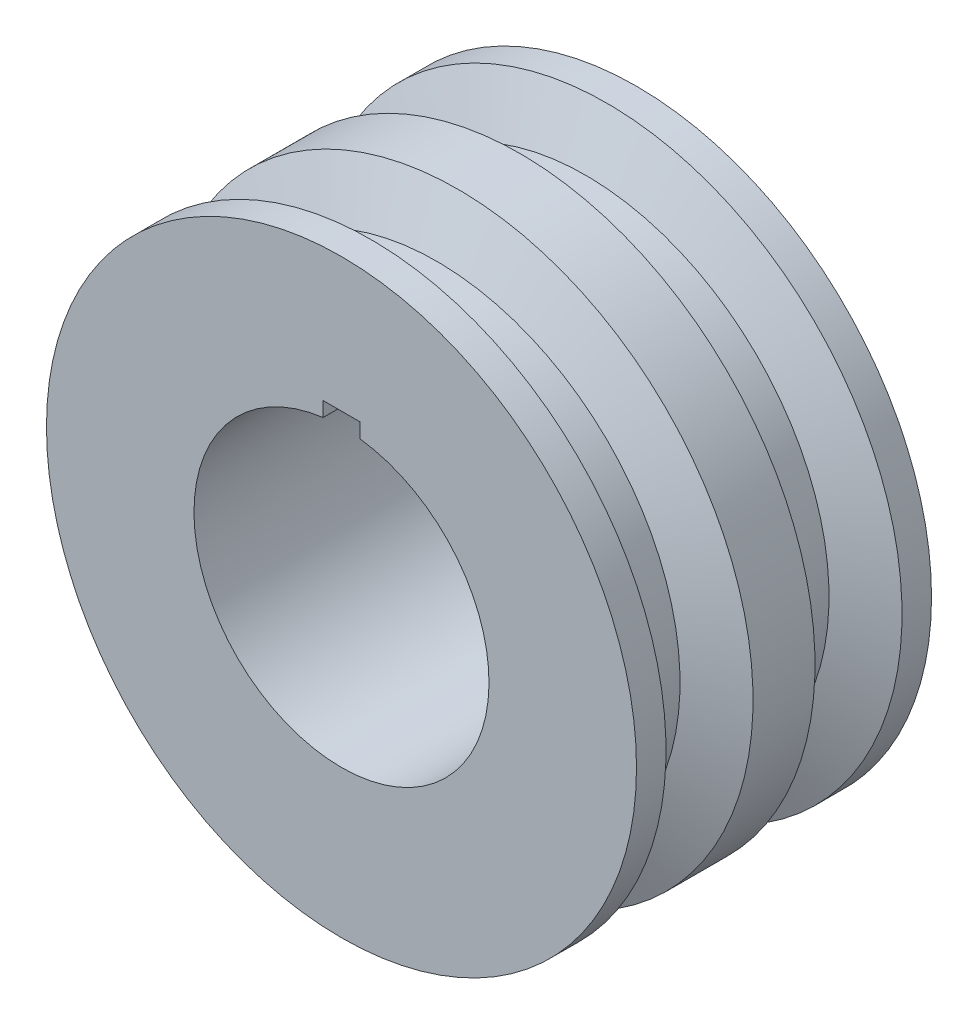
ISO-10303-21;
HEADER;
FILE_DESCRIPTION(('STEP AP214'),'2;1');
FILE_NAME('part.step','',(''),(''),'','','');
FILE_SCHEMA(('AUTOMOTIVE_DESIGN { 1 0 10303 214 1 1 1 1 }'));
ENDSEC;
DATA;
#1=APPLICATION_CONTEXT('core data for automotive mechanical design processes');
#2=APPLICATION_PROTOCOL_DEFINITION('international standard','automotive_design',2000,#1);
#3=PRODUCT_CONTEXT('',#1,'mechanical');
#4=PRODUCT('Part','Part','',(#3));
#5=PRODUCT_RELATED_PRODUCT_CATEGORY('part','',(#4));
#6=PRODUCT_DEFINITION_FORMATION('','',#4);
#7=PRODUCT_DEFINITION_CONTEXT('part definition',#1,'design');
#8=PRODUCT_DEFINITION('design','',#6,#7);
#9=PRODUCT_DEFINITION_SHAPE('','',#8);
#10=(LENGTH_UNIT() NAMED_UNIT(*) SI_UNIT(.MILLI.,.METRE.));
#11=(NAMED_UNIT(*) PLANE_ANGLE_UNIT() SI_UNIT($,.RADIAN.));
#12=(NAMED_UNIT(*) SI_UNIT($,.STERADIAN.) SOLID_ANGLE_UNIT());
#13=UNCERTAINTY_MEASURE_WITH_UNIT(LENGTH_MEASURE(1.E-05),#10,'distance_accuracy_value','');
#14=(GEOMETRIC_REPRESENTATION_CONTEXT(3) GLOBAL_UNCERTAINTY_ASSIGNED_CONTEXT((#13)) GLOBAL_UNIT_ASSIGNED_CONTEXT((#10,
#11,#12)) REPRESENTATION_CONTEXT('',''));
#15=CARTESIAN_POINT('',(0.,0.,0.));
#16=DIRECTION('',(0.,0.,1.));
#17=DIRECTION('',(1.,0.,0.));
#18=AXIS2_PLACEMENT_3D('',#15,#16,#17);
#19=CARTESIAN_POINT('',(0.,0.,40.));
#20=DIRECTION('',(0.,0.,-1.));
#21=DIRECTION('',(-1.,0.,0.));
#22=AXIS2_PLACEMENT_3D('',#19,#20,#21);
#23=CYLINDRICAL_SURFACE('',#22,40.);
#24=CARTESIAN_POINT('',(0.,0.,0.));
#25=DIRECTION('',(0.,0.,1.));
#26=DIRECTION('',(1.,0.,0.));
#27=AXIS2_PLACEMENT_3D('',#24,#25,#26);
#28=CIRCLE('',#27,40.);
#29=CARTESIAN_POINT('',(40.,0.,0.));
#30=VERTEX_POINT('',#29);
#31=EDGE_CURVE('E42',#30,#30,#28,.T.);
#32=ORIENTED_EDGE('',*,*,#31,.T.);
#33=EDGE_LOOP('',(#32));
#34=FACE_BOUND('',#33,.T.);
#35=CARTESIAN_POINT('',(0.,0.,4.));
#36=DIRECTION('',(0.,0.,-1.));
#37=DIRECTION('',(-1.,0.,0.));
#38=AXIS2_PLACEMENT_3D('',#35,#36,#37);
#39=CIRCLE('',#38,40.);
#40=CARTESIAN_POINT('',(-40.,0.,4.));
#41=VERTEX_POINT('',#40);
#42=EDGE_CURVE('E114',#41,#41,#39,.T.);
#43=ORIENTED_EDGE('',*,*,#42,.T.);
#44=EDGE_LOOP('',(#43));
#45=FACE_BOUND('',#44,.T.);
#46=ADVANCED_FACE('F39',(#34,#45),#23,.T.);
#47=CARTESIAN_POINT('',(0.,0.,40.));
#48=DIRECTION('',(0.,0.,1.));
#49=DIRECTION('',(1.,0.,0.));
#50=AXIS2_PLACEMENT_3D('',#47,#48,#49);
#51=CIRCLE('',#50,40.);
#52=CARTESIAN_POINT('',(40.,0.,40.));
#53=VERTEX_POINT('',#52);
#54=EDGE_CURVE('E11',#53,#53,#51,.T.);
#55=ORIENTED_EDGE('',*,*,#54,.F.);
#56=EDGE_LOOP('',(#55));
#57=FACE_BOUND('',#56,.T.);
#58=CARTESIAN_POINT('',(0.,0.,36.));
#59=DIRECTION('',(0.,0.,-1.));
#60=DIRECTION('',(-1.,0.,0.));
#61=AXIS2_PLACEMENT_3D('',#58,#59,#60);
#62=CIRCLE('',#61,40.);
#63=CARTESIAN_POINT('',(-40.,0.,36.));
#64=VERTEX_POINT('',#63);
#65=EDGE_CURVE('E190',#64,#64,#62,.T.);
#66=ORIENTED_EDGE('',*,*,#65,.F.);
#67=EDGE_LOOP('',(#66));
#68=FACE_BOUND('',#67,.T.);
#69=ADVANCED_FACE('F147',(#57,#68),#23,.T.);
#70=CARTESIAN_POINT('',(0.,0.,40.));
#71=DIRECTION('',(0.,0.,1.));
#72=DIRECTION('',(1.,0.,0.));
#73=AXIS2_PLACEMENT_3D('',#70,#71,#72);
#74=PLANE('',#73);
#75=ORIENTED_EDGE('',*,*,#54,.T.);
#76=EDGE_LOOP('',(#75));
#77=FACE_BOUND('',#76,.T.);
#78=DIRECTION('',(0.,1.,0.));
#79=VECTOR('',#78,1.);
#80=CARTESIAN_POINT('',(2.5,21.8431348329844,40.));
#81=LINE('',#80,#79);
#82=CARTESIAN_POINT('',(2.5,19.8431348329844,40.));
#83=VERTEX_POINT('',#82);
#84=CARTESIAN_POINT('',(2.5,21.8431348329844,40.));
#85=VERTEX_POINT('',#84);
#86=EDGE_CURVE('E89',#83,#85,#81,.T.);
#87=ORIENTED_EDGE('',*,*,#86,.F.);
#88=CARTESIAN_POINT('',(0.,0.,40.));
#89=DIRECTION('',(0.,0.,1.));
#90=DIRECTION('',(1.,0.,0.));
#91=AXIS2_PLACEMENT_3D('',#88,#89,#90);
#92=CIRCLE('',#91,20.);
#93=CARTESIAN_POINT('',(-2.5,19.8431348329844,40.));
#94=VERTEX_POINT('',#93);
#95=EDGE_CURVE('E80',#94,#83,#92,.T.);
#96=ORIENTED_EDGE('',*,*,#95,.F.);
#97=DIRECTION('',(0.,-1.,0.));
#98=VECTOR('',#97,1.);
#99=CARTESIAN_POINT('',(-2.5,19.8431348329844,40.));
#100=LINE('',#99,#98);
#101=CARTESIAN_POINT('',(-2.5,21.8431348329844,40.));
#102=VERTEX_POINT('',#101);
#103=EDGE_CURVE('E106',#102,#94,#100,.T.);
#104=ORIENTED_EDGE('',*,*,#103,.F.);
#105=DIRECTION('',(-1.,0.,0.));
#106=VECTOR('',#105,1.);
#107=CARTESIAN_POINT('',(-2.5,21.8431348329844,40.));
#108=LINE('',#107,#106);
#109=EDGE_CURVE('E102',#85,#102,#108,.T.);
#110=ORIENTED_EDGE('',*,*,#109,.F.);
#111=EDGE_LOOP('',(#87,#96,#104,#110));
#112=FACE_BOUND('',#111,.T.);
#113=ADVANCED_FACE('F101',(#77,#112),#74,.T.);
#114=CARTESIAN_POINT('',(0.,0.,0.));
#115=DIRECTION('',(0.,0.,1.));
#116=DIRECTION('',(1.,0.,0.));
#117=AXIS2_PLACEMENT_3D('',#114,#115,#116);
#118=PLANE('',#117);
#119=ORIENTED_EDGE('',*,*,#31,.F.);
#120=EDGE_LOOP('',(#119));
#121=FACE_BOUND('',#120,.T.);
#122=CARTESIAN_POINT('',(0.,0.,0.));
#123=DIRECTION('',(0.,0.,1.));
#124=DIRECTION('',(1.,0.,0.));
#125=AXIS2_PLACEMENT_3D('',#122,#123,#124);
#126=CIRCLE('',#125,20.);
#127=CARTESIAN_POINT('',(-2.5,19.8431348329844,0.));
#128=VERTEX_POINT('',#127);
#129=CARTESIAN_POINT('',(2.5,19.8431348329844,0.));
#130=VERTEX_POINT('',#129);
#131=EDGE_CURVE('E62',#128,#130,#126,.T.);
#132=ORIENTED_EDGE('',*,*,#131,.T.);
#133=DIRECTION('',(0.,1.,0.));
#134=VECTOR('',#133,1.);
#135=CARTESIAN_POINT('',(2.5,21.8431348329844,0.));
#136=LINE('',#135,#134);
#137=CARTESIAN_POINT('',(2.5,21.8431348329844,0.));
#138=VERTEX_POINT('',#137);
#139=EDGE_CURVE('E96',#130,#138,#136,.T.);
#140=ORIENTED_EDGE('',*,*,#139,.T.);
#141=DIRECTION('',(-1.,0.,0.));
#142=VECTOR('',#141,1.);
#143=CARTESIAN_POINT('',(-2.5,21.8431348329844,0.));
#144=LINE('',#143,#142);
#145=CARTESIAN_POINT('',(-2.5,21.8431348329844,0.));
#146=VERTEX_POINT('',#145);
#147=EDGE_CURVE('E117',#138,#146,#144,.T.);
#148=ORIENTED_EDGE('',*,*,#147,.T.);
#149=DIRECTION('',(0.,-1.,0.));
#150=VECTOR('',#149,1.);
#151=CARTESIAN_POINT('',(-2.5,19.8431348329844,0.));
#152=LINE('',#151,#150);
#153=EDGE_CURVE('E90',#146,#128,#152,.T.);
#154=ORIENTED_EDGE('',*,*,#153,.T.);
#155=EDGE_LOOP('',(#132,#140,#148,#154));
#156=FACE_BOUND('',#155,.T.);
#157=ADVANCED_FACE('F133',(#121,#156),#118,.F.);
#158=CARTESIAN_POINT('',(0.,0.,40.));
#159=DIRECTION('',(0.,0.,-1.));
#160=DIRECTION('',(-1.,0.,0.));
#161=AXIS2_PLACEMENT_3D('',#158,#159,#160);
#162=CYLINDRICAL_SURFACE('',#161,20.);
#163=ORIENTED_EDGE('',*,*,#131,.F.);
#164=DIRECTION('',(0.,0.,-1.));
#165=VECTOR('',#164,1.);
#166=CARTESIAN_POINT('',(-2.5,19.8431348329844,40.));
#167=LINE('',#166,#165);
#168=EDGE_CURVE('E84',#94,#128,#167,.T.);
#169=ORIENTED_EDGE('',*,*,#168,.F.);
#170=ORIENTED_EDGE('',*,*,#95,.T.);
#171=DIRECTION('',(0.,0.,-1.));
#172=VECTOR('',#171,1.);
#173=CARTESIAN_POINT('',(2.5,19.8431348329844,40.));
#174=LINE('',#173,#172);
#175=EDGE_CURVE('E83',#83,#130,#174,.T.);
#176=ORIENTED_EDGE('',*,*,#175,.T.);
#177=EDGE_LOOP('',(#163,#169,#170,#176));
#178=FACE_BOUND('',#177,.T.);
#179=ADVANCED_FACE('F82',(#178),#162,.F.);
#180=CARTESIAN_POINT('',(2.5,21.8431348329844,40.));
#181=DIRECTION('',(-1.,0.,0.));
#182=DIRECTION('',(0.,-1.,0.));
#183=AXIS2_PLACEMENT_3D('',#180,#181,#182);
#184=PLANE('',#183);
#185=ORIENTED_EDGE('',*,*,#139,.F.);
#186=ORIENTED_EDGE('',*,*,#175,.F.);
#187=ORIENTED_EDGE('',*,*,#86,.T.);
#188=DIRECTION('',(0.,0.,-1.));
#189=VECTOR('',#188,1.);
#190=CARTESIAN_POINT('',(2.5,21.8431348329844,40.));
#191=LINE('',#190,#189);
#192=EDGE_CURVE('E98',#85,#138,#191,.T.);
#193=ORIENTED_EDGE('',*,*,#192,.T.);
#194=EDGE_LOOP('',(#185,#186,#187,#193));
#195=FACE_BOUND('',#194,.T.);
#196=ADVANCED_FACE('F93',(#195),#184,.T.);
#197=CARTESIAN_POINT('',(-2.5,21.8431348329844,40.));
#198=DIRECTION('',(0.,-1.,0.));
#199=DIRECTION('',(0.,0.,-1.));
#200=AXIS2_PLACEMENT_3D('',#197,#198,#199);
#201=PLANE('',#200);
#202=ORIENTED_EDGE('',*,*,#147,.F.);
#203=ORIENTED_EDGE('',*,*,#192,.F.);
#204=ORIENTED_EDGE('',*,*,#109,.T.);
#205=DIRECTION('',(0.,0.,-1.));
#206=VECTOR('',#205,1.);
#207=CARTESIAN_POINT('',(-2.5,21.8431348329844,40.));
#208=LINE('',#207,#206);
#209=EDGE_CURVE('E54',#102,#146,#208,.T.);
#210=ORIENTED_EDGE('',*,*,#209,.T.);
#211=EDGE_LOOP('',(#202,#203,#204,#210));
#212=FACE_BOUND('',#211,.T.);
#213=ADVANCED_FACE('F131',(#212),#201,.T.);
#214=CARTESIAN_POINT('',(-2.5,19.8431348329844,40.));
#215=DIRECTION('',(1.,0.,0.));
#216=DIRECTION('',(0.,1.,0.));
#217=AXIS2_PLACEMENT_3D('',#214,#215,#216);
#218=PLANE('',#217);
#219=ORIENTED_EDGE('',*,*,#153,.F.);
#220=ORIENTED_EDGE('',*,*,#209,.F.);
#221=ORIENTED_EDGE('',*,*,#103,.T.);
#222=ORIENTED_EDGE('',*,*,#168,.T.);
#223=EDGE_LOOP('',(#219,#220,#221,#222));
#224=FACE_BOUND('',#223,.T.);
#225=ADVANCED_FACE('F134',(#224),#218,.T.);
#226=CARTESIAN_POINT('',(0.,0.,33.1005050633884));
#227=DIRECTION('',(0.,0.,1.));
#228=DIRECTION('',(1.,0.,0.));
#229=AXIS2_PLACEMENT_3D('',#226,#227,#228);
#230=CONICAL_SURFACE('',#229,33.,1.17809724509618);
#231=ORIENTED_EDGE('',*,*,#65,.T.);
#232=EDGE_LOOP('',(#231));
#233=FACE_BOUND('',#232,.T.);
#234=CARTESIAN_POINT('',(0.,0.,33.1005050633884));
#235=DIRECTION('',(0.,0.,-1.));
#236=DIRECTION('',(-1.,0.,0.));
#237=AXIS2_PLACEMENT_3D('',#234,#235,#236);
#238=CIRCLE('',#237,33.);
#239=CARTESIAN_POINT('',(-33.,0.,33.1005050633884));
#240=VERTEX_POINT('',#239);
#241=EDGE_CURVE('E174',#240,#240,#238,.T.);
#242=ORIENTED_EDGE('',*,*,#241,.F.);
#243=EDGE_LOOP('',(#242));
#244=FACE_BOUND('',#243,.T.);
#245=ADVANCED_FACE('F136',(#233,#244),#230,.T.);
#246=CARTESIAN_POINT('',(0.,0.,0.));
#247=DIRECTION('',(0.,0.,-1.));
#248=DIRECTION('',(-1.,0.,0.));
#249=AXIS2_PLACEMENT_3D('',#246,#247,#248);
#250=CYLINDRICAL_SURFACE('',#249,33.);
#251=ORIENTED_EDGE('',*,*,#241,.T.);
#252=EDGE_LOOP('',(#251));
#253=FACE_BOUND('',#252,.T.);
#254=CARTESIAN_POINT('',(0.,0.,27.1005050633884));
#255=DIRECTION('',(0.,0.,-1.));
#256=DIRECTION('',(-1.,0.,0.));
#257=AXIS2_PLACEMENT_3D('',#254,#255,#256);
#258=CIRCLE('',#257,33.);
#259=CARTESIAN_POINT('',(-33.,0.,27.1005050633884));
#260=VERTEX_POINT('',#259);
#261=EDGE_CURVE('E182',#260,#260,#258,.T.);
#262=ORIENTED_EDGE('',*,*,#261,.F.);
#263=EDGE_LOOP('',(#262));
#264=FACE_BOUND('',#263,.T.);
#265=ADVANCED_FACE('F142',(#253,#264),#250,.T.);
#266=CARTESIAN_POINT('',(0.,0.,24.2010101267767));
#267=DIRECTION('',(0.,0.,-1.));
#268=DIRECTION('',(-1.,0.,0.));
#269=AXIS2_PLACEMENT_3D('',#266,#267,#268);
#270=CONICAL_SURFACE('',#269,40.,1.17809724509617);
#271=ORIENTED_EDGE('',*,*,#261,.T.);
#272=EDGE_LOOP('',(#271));
#273=FACE_BOUND('',#272,.T.);
#274=CARTESIAN_POINT('',(0.,0.,24.2010101267767));
#275=DIRECTION('',(0.,0.,-1.));
#276=DIRECTION('',(-1.,0.,0.));
#277=AXIS2_PLACEMENT_3D('',#274,#275,#276);
#278=CIRCLE('',#277,40.);
#279=CARTESIAN_POINT('',(-40.,0.,24.2010101267767));
#280=VERTEX_POINT('',#279);
#281=EDGE_CURVE('E168',#280,#280,#278,.T.);
#282=ORIENTED_EDGE('',*,*,#281,.F.);
#283=EDGE_LOOP('',(#282));
#284=FACE_BOUND('',#283,.T.);
#285=ADVANCED_FACE('F200',(#273,#284),#270,.T.);
#286=CARTESIAN_POINT('',(0.,0.,4.));
#287=DIRECTION('',(0.,0.,-1.));
#288=DIRECTION('',(-1.,0.,0.));
#289=AXIS2_PLACEMENT_3D('',#286,#287,#288);
#290=CONICAL_SURFACE('',#289,40.,1.17809724509618);
#291=CARTESIAN_POINT('',(0.,0.,6.89949493661164));
#292=DIRECTION('',(0.,0.,-1.));
#293=DIRECTION('',(-1.,0.,0.));
#294=AXIS2_PLACEMENT_3D('',#291,#292,#293);
#295=CIRCLE('',#294,33.);
#296=CARTESIAN_POINT('',(-33.,0.,6.89949493661164));
#297=VERTEX_POINT('',#296);
#298=EDGE_CURVE('E179',#297,#297,#295,.T.);
#299=ORIENTED_EDGE('',*,*,#298,.T.);
#300=EDGE_LOOP('',(#299));
#301=FACE_BOUND('',#300,.T.);
#302=ORIENTED_EDGE('',*,*,#42,.F.);
#303=EDGE_LOOP('',(#302));
#304=FACE_BOUND('',#303,.T.);
#305=ADVANCED_FACE('F209',(#301,#304),#290,.T.);
#306=CARTESIAN_POINT('',(0.,0.,0.));
#307=DIRECTION('',(0.,0.,-1.));
#308=DIRECTION('',(-1.,0.,0.));
#309=AXIS2_PLACEMENT_3D('',#306,#307,#308);
#310=CYLINDRICAL_SURFACE('',#309,33.);
#311=CARTESIAN_POINT('',(0.,0.,12.8994949366116));
#312=DIRECTION('',(0.,0.,-1.));
#313=DIRECTION('',(-1.,0.,0.));
#314=AXIS2_PLACEMENT_3D('',#311,#312,#313);
#315=CIRCLE('',#314,33.);
#316=CARTESIAN_POINT('',(-33.,0.,12.8994949366116));
#317=VERTEX_POINT('',#316);
#318=EDGE_CURVE('E173',#317,#317,#315,.T.);
#319=ORIENTED_EDGE('',*,*,#318,.T.);
#320=EDGE_LOOP('',(#319));
#321=FACE_BOUND('',#320,.T.);
#322=ORIENTED_EDGE('',*,*,#298,.F.);
#323=EDGE_LOOP('',(#322));
#324=FACE_BOUND('',#323,.T.);
#325=ADVANCED_FACE('F162',(#321,#324),#310,.T.);
#326=CARTESIAN_POINT('',(0.,0.,12.8994949366116));
#327=DIRECTION('',(0.,0.,1.));
#328=DIRECTION('',(1.,0.,0.));
#329=AXIS2_PLACEMENT_3D('',#326,#327,#328);
#330=CONICAL_SURFACE('',#329,33.,1.17809724509617);
#331=CARTESIAN_POINT('',(0.,0.,15.7989898732233));
#332=DIRECTION('',(0.,0.,-1.));
#333=DIRECTION('',(-1.,0.,0.));
#334=AXIS2_PLACEMENT_3D('',#331,#332,#333);
#335=CIRCLE('',#334,40.);
#336=CARTESIAN_POINT('',(-40.,0.,15.7989898732233));
#337=VERTEX_POINT('',#336);
#338=EDGE_CURVE('E171',#337,#337,#335,.T.);
#339=ORIENTED_EDGE('',*,*,#338,.T.);
#340=EDGE_LOOP('',(#339));
#341=FACE_BOUND('',#340,.T.);
#342=ORIENTED_EDGE('',*,*,#318,.F.);
#343=EDGE_LOOP('',(#342));
#344=FACE_BOUND('',#343,.T.);
#345=ADVANCED_FACE('F157',(#341,#344),#330,.T.);
#346=ORIENTED_EDGE('',*,*,#281,.T.);
#347=EDGE_LOOP('',(#346));
#348=FACE_BOUND('',#347,.T.);
#349=ORIENTED_EDGE('',*,*,#338,.F.);
#350=EDGE_LOOP('',(#349));
#351=FACE_BOUND('',#350,.T.);
#352=ADVANCED_FACE('F149',(#348,#351),#23,.T.);
#353=CLOSED_SHELL('',(#46,#69,#113,#157,#179,#196,#213,#225,#245,#265,#285,#305,#325,#345,#352));
#354=MANIFOLD_SOLID_BREP('B2',#353);
#355=ADVANCED_BREP_SHAPE_REPRESENTATION('',(#18,#354),#14);
#356=SHAPE_DEFINITION_REPRESENTATION(#9,#355);
ENDSEC;
END-ISO-10303-21;
